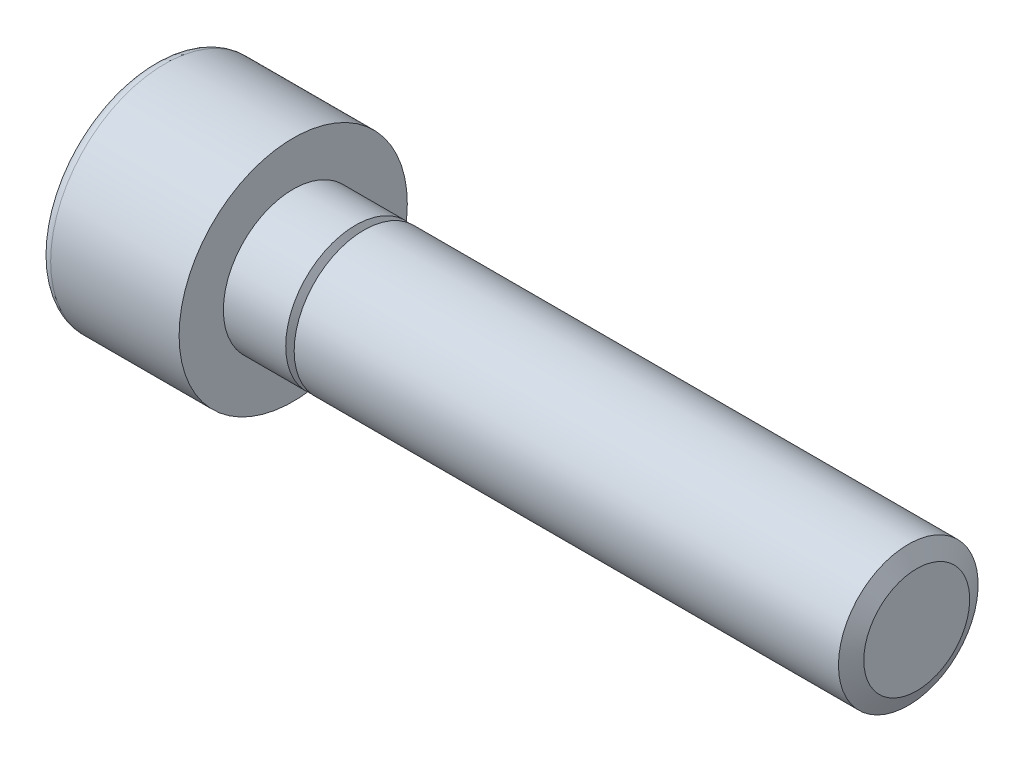
ISO-10303-21;
HEADER;
FILE_DESCRIPTION(('STEP AP214'),'2;1');
FILE_NAME('part.step','',(''),(''),'','','');
FILE_SCHEMA(('AUTOMOTIVE_DESIGN { 1 0 10303 214 1 1 1 1 }'));
ENDSEC;
DATA;
#1=APPLICATION_CONTEXT('core data for automotive mechanical design processes');
#2=APPLICATION_PROTOCOL_DEFINITION('international standard','automotive_design',2000,#1);
#3=PRODUCT_CONTEXT('',#1,'mechanical');
#4=PRODUCT('Part','Part','',(#3));
#5=PRODUCT_RELATED_PRODUCT_CATEGORY('part','',(#4));
#6=PRODUCT_DEFINITION_FORMATION('','',#4);
#7=PRODUCT_DEFINITION_CONTEXT('part definition',#1,'design');
#8=PRODUCT_DEFINITION('design','',#6,#7);
#9=PRODUCT_DEFINITION_SHAPE('','',#8);
#10=(LENGTH_UNIT() NAMED_UNIT(*) SI_UNIT(.MILLI.,.METRE.));
#11=(NAMED_UNIT(*) PLANE_ANGLE_UNIT() SI_UNIT($,.RADIAN.));
#12=(NAMED_UNIT(*) SI_UNIT($,.STERADIAN.) SOLID_ANGLE_UNIT());
#13=UNCERTAINTY_MEASURE_WITH_UNIT(LENGTH_MEASURE(1.E-05),#10,'distance_accuracy_value','');
#14=(GEOMETRIC_REPRESENTATION_CONTEXT(3) GLOBAL_UNCERTAINTY_ASSIGNED_CONTEXT((#13)) GLOBAL_UNIT_ASSIGNED_CONTEXT((#10,
#11,#12)) REPRESENTATION_CONTEXT('',''));
#15=CARTESIAN_POINT('',(0.,0.,0.));
#16=DIRECTION('',(0.,0.,1.));
#17=DIRECTION('',(1.,0.,0.));
#18=AXIS2_PLACEMENT_3D('',#15,#16,#17);
#19=CARTESIAN_POINT('',(-2.8448,0.,0.));
#20=DIRECTION('',(-1.,0.,0.));
#21=DIRECTION('',(0.,0.,1.));
#22=AXIS2_PLACEMENT_3D('',#19,#20,#21);
#23=PLANE('',#22);
#24=CARTESIAN_POINT('',(-2.8448,0.,0.));
#25=DIRECTION('',(-1.,0.,0.));
#26=DIRECTION('',(0.,0.,1.));
#27=AXIS2_PLACEMENT_3D('',#24,#25,#26);
#28=CIRCLE('',#27,2.0955);
#29=CARTESIAN_POINT('',(-2.8448,0.,2.0955));
#30=VERTEX_POINT('',#29);
#31=EDGE_CURVE('E105',#30,#30,#28,.T.);
#32=ORIENTED_EDGE('',*,*,#31,.T.);
#33=EDGE_LOOP('',(#32));
#34=FACE_BOUND('',#33,.T.);
#35=DIRECTION('',(0.,-1.,0.));
#36=VECTOR('',#35,1.);
#37=CARTESIAN_POINT('',(-2.8448,0.,1.1938));
#38=LINE('',#37,#36);
#39=CARTESIAN_POINT('',(-2.8448,0.689240751358576,1.1938));
#40=VERTEX_POINT('',#39);
#41=CARTESIAN_POINT('',(-2.8448,-0.689240751358574,1.1938));
#42=VERTEX_POINT('',#41);
#43=EDGE_CURVE('E133',#40,#42,#38,.T.);
#44=ORIENTED_EDGE('',*,*,#43,.T.);
#45=DIRECTION('',(0.,-0.5,-0.866025403784439));
#46=VECTOR('',#45,1.);
#47=CARTESIAN_POINT('',(-2.8448,-1.03386112703786,0.5969));
#48=LINE('',#47,#46);
#49=CARTESIAN_POINT('',(-2.8448,-1.37848150271715,0.));
#50=VERTEX_POINT('',#49);
#51=EDGE_CURVE('E10',#42,#50,#48,.T.);
#52=ORIENTED_EDGE('',*,*,#51,.T.);
#53=DIRECTION('',(0.,0.5,-0.866025403784439));
#54=VECTOR('',#53,1.);
#55=CARTESIAN_POINT('',(-2.8448,-1.03386112703786,-0.5969));
#56=LINE('',#55,#54);
#57=CARTESIAN_POINT('',(-2.8448,-0.689240751358576,-1.1938));
#58=VERTEX_POINT('',#57);
#59=EDGE_CURVE('E24',#50,#58,#56,.T.);
#60=ORIENTED_EDGE('',*,*,#59,.T.);
#61=DIRECTION('',(0.,1.,0.));
#62=VECTOR('',#61,1.);
#63=CARTESIAN_POINT('',(-2.8448,0.,-1.1938));
#64=LINE('',#63,#62);
#65=CARTESIAN_POINT('',(-2.8448,0.689240751358575,-1.1938));
#66=VERTEX_POINT('',#65);
#67=EDGE_CURVE('E145',#58,#66,#64,.T.);
#68=ORIENTED_EDGE('',*,*,#67,.T.);
#69=DIRECTION('',(0.,0.5,0.866025403784439));
#70=VECTOR('',#69,1.);
#71=CARTESIAN_POINT('',(-2.8448,1.03386112703786,-0.5969));
#72=LINE('',#71,#70);
#73=CARTESIAN_POINT('',(-2.8448,1.37848150271715,0.));
#74=VERTEX_POINT('',#73);
#75=EDGE_CURVE('E141',#66,#74,#72,.T.);
#76=ORIENTED_EDGE('',*,*,#75,.T.);
#77=DIRECTION('',(0.,-0.5,0.866025403784439));
#78=VECTOR('',#77,1.);
#79=CARTESIAN_POINT('',(-2.8448,1.03386112703786,0.5969));
#80=LINE('',#79,#78);
#81=EDGE_CURVE('E137',#74,#40,#80,.T.);
#82=ORIENTED_EDGE('',*,*,#81,.T.);
#83=EDGE_LOOP('',(#44,#52,#60,#68,#76,#82));
#84=FACE_BOUND('',#83,.T.);
#85=ADVANCED_FACE('F15',(#34,#84),#23,.T.);
#86=CARTESIAN_POINT('',(0.,-2.3241,0.));
#87=DIRECTION('',(1.,0.,0.));
#88=DIRECTION('',(0.,0.,-1.));
#89=AXIS2_PLACEMENT_3D('',#86,#87,#88);
#90=PLANE('',#89);
#91=CARTESIAN_POINT('',(0.,0.,0.));
#92=DIRECTION('',(-1.,0.,0.));
#93=DIRECTION('',(0.,0.,1.));
#94=AXIS2_PLACEMENT_3D('',#91,#92,#93);
#95=CIRCLE('',#94,1.4224);
#96=CARTESIAN_POINT('',(0.,0.,1.4224));
#97=VERTEX_POINT('',#96);
#98=EDGE_CURVE('E129',#97,#97,#95,.T.);
#99=ORIENTED_EDGE('',*,*,#98,.T.);
#100=EDGE_LOOP('',(#99));
#101=FACE_BOUND('',#100,.T.);
#102=CARTESIAN_POINT('',(0.,0.,0.));
#103=DIRECTION('',(-1.,0.,0.));
#104=DIRECTION('',(0.,0.,1.));
#105=AXIS2_PLACEMENT_3D('',#102,#103,#104);
#106=CIRCLE('',#105,2.3241);
#107=CARTESIAN_POINT('',(0.,0.,2.3241));
#108=VERTEX_POINT('',#107);
#109=EDGE_CURVE('E87',#108,#108,#106,.T.);
#110=ORIENTED_EDGE('',*,*,#109,.F.);
#111=EDGE_LOOP('',(#110));
#112=FACE_BOUND('',#111,.T.);
#113=ADVANCED_FACE('F17',(#101,#112),#90,.T.);
#114=CARTESIAN_POINT('',(-2.8448,0.,0.));
#115=DIRECTION('',(-1.,0.,0.));
#116=DIRECTION('',(0.,0.,1.));
#117=AXIS2_PLACEMENT_3D('',#114,#115,#116);
#118=CYLINDRICAL_SURFACE('',#117,1.4224);
#119=CARTESIAN_POINT('',(1.27,0.,0.));
#120=DIRECTION('',(-1.,0.,0.));
#121=DIRECTION('',(0.,0.,1.));
#122=AXIS2_PLACEMENT_3D('',#119,#120,#121);
#123=CIRCLE('',#122,1.4224);
#124=CARTESIAN_POINT('',(1.27,0.,1.4224));
#125=VERTEX_POINT('',#124);
#126=EDGE_CURVE('E125',#125,#125,#123,.T.);
#127=ORIENTED_EDGE('',*,*,#126,.T.);
#128=EDGE_LOOP('',(#127));
#129=FACE_BOUND('',#128,.T.);
#130=ORIENTED_EDGE('',*,*,#98,.F.);
#131=EDGE_LOOP('',(#130));
#132=FACE_BOUND('',#131,.T.);
#133=ADVANCED_FACE('F331',(#129,#132),#118,.T.);
#134=CARTESIAN_POINT('',(1.27,0.,0.));
#135=DIRECTION('',(-1.,0.,0.));
#136=DIRECTION('',(0.,0.,1.));
#137=AXIS2_PLACEMENT_3D('',#134,#135,#136);
#138=CONICAL_SURFACE('',#137,1.4224,1.10714871779409);
#139=CARTESIAN_POINT('',(1.442085,0.,0.));
#140=DIRECTION('',(-1.,0.,0.));
#141=DIRECTION('',(0.,0.,1.));
#142=AXIS2_PLACEMENT_3D('',#139,#140,#141);
#143=CIRCLE('',#142,1.07823);
#144=CARTESIAN_POINT('',(1.442085,0.,1.07823));
#145=VERTEX_POINT('',#144);
#146=EDGE_CURVE('E121',#145,#145,#143,.T.);
#147=ORIENTED_EDGE('',*,*,#146,.T.);
#148=EDGE_LOOP('',(#147));
#149=FACE_BOUND('',#148,.T.);
#150=ORIENTED_EDGE('',*,*,#126,.F.);
#151=EDGE_LOOP('',(#150));
#152=FACE_BOUND('',#151,.T.);
#153=ADVANCED_FACE('F320',(#149,#152),#138,.T.);
#154=CARTESIAN_POINT('',(1.442085,-1.07823,0.));
#155=DIRECTION('',(-1.,0.,0.));
#156=DIRECTION('',(0.,0.,1.));
#157=AXIS2_PLACEMENT_3D('',#154,#155,#156);
#158=PLANE('',#157);
#159=CARTESIAN_POINT('',(1.442085,0.,0.));
#160=DIRECTION('',(-1.,0.,0.));
#161=DIRECTION('',(0.,0.,1.));
#162=AXIS2_PLACEMENT_3D('',#159,#160,#161);
#163=CIRCLE('',#162,1.4224);
#164=CARTESIAN_POINT('',(1.442085,0.,1.4224));
#165=VERTEX_POINT('',#164);
#166=EDGE_CURVE('E117',#165,#165,#163,.T.);
#167=ORIENTED_EDGE('',*,*,#166,.T.);
#168=EDGE_LOOP('',(#167));
#169=FACE_BOUND('',#168,.T.);
#170=ORIENTED_EDGE('',*,*,#146,.F.);
#171=EDGE_LOOP('',(#170));
#172=FACE_BOUND('',#171,.T.);
#173=ADVANCED_FACE('F309',(#169,#172),#158,.T.);
#174=CARTESIAN_POINT('',(-2.8448,0.,0.));
#175=DIRECTION('',(-1.,0.,0.));
#176=DIRECTION('',(0.,0.,1.));
#177=AXIS2_PLACEMENT_3D('',#174,#175,#176);
#178=CYLINDRICAL_SURFACE('',#177,1.4224);
#179=CARTESIAN_POINT('',(12.527915,0.,0.));
#180=DIRECTION('',(-1.,0.,0.));
#181=DIRECTION('',(0.,0.,1.));
#182=AXIS2_PLACEMENT_3D('',#179,#180,#181);
#183=CIRCLE('',#182,1.4224);
#184=CARTESIAN_POINT('',(12.527915,0.,1.4224));
#185=VERTEX_POINT('',#184);
#186=EDGE_CURVE('E113',#185,#185,#183,.T.);
#187=ORIENTED_EDGE('',*,*,#186,.T.);
#188=EDGE_LOOP('',(#187));
#189=FACE_BOUND('',#188,.T.);
#190=ORIENTED_EDGE('',*,*,#166,.F.);
#191=EDGE_LOOP('',(#190));
#192=FACE_BOUND('',#191,.T.);
#193=ADVANCED_FACE('F298',(#189,#192),#178,.T.);
#194=CARTESIAN_POINT('',(12.527915,0.,0.));
#195=DIRECTION('',(-1.,0.,0.));
#196=DIRECTION('',(0.,0.,1.));
#197=AXIS2_PLACEMENT_3D('',#194,#195,#196);
#198=CONICAL_SURFACE('',#197,1.4224,1.10714871779409);
#199=CARTESIAN_POINT('',(12.7,0.,0.));
#200=DIRECTION('',(-1.,0.,0.));
#201=DIRECTION('',(0.,0.,1.));
#202=AXIS2_PLACEMENT_3D('',#199,#200,#201);
#203=CIRCLE('',#202,1.07823);
#204=CARTESIAN_POINT('',(12.7,0.,1.07823));
#205=VERTEX_POINT('',#204);
#206=EDGE_CURVE('E109',#205,#205,#203,.T.);
#207=ORIENTED_EDGE('',*,*,#206,.T.);
#208=EDGE_LOOP('',(#207));
#209=FACE_BOUND('',#208,.T.);
#210=ORIENTED_EDGE('',*,*,#186,.F.);
#211=EDGE_LOOP('',(#210));
#212=FACE_BOUND('',#211,.T.);
#213=ADVANCED_FACE('F287',(#209,#212),#198,.T.);
#214=CARTESIAN_POINT('',(12.7,-1.07823,0.));
#215=DIRECTION('',(1.,0.,0.));
#216=DIRECTION('',(0.,0.,-1.));
#217=AXIS2_PLACEMENT_3D('',#214,#215,#216);
#218=PLANE('',#217);
#219=ORIENTED_EDGE('',*,*,#206,.F.);
#220=EDGE_LOOP('',(#219));
#221=FACE_BOUND('',#220,.T.);
#222=ADVANCED_FACE('F276',(#221),#218,.T.);
#223=CARTESIAN_POINT('',(-2.6162,0.,0.));
#224=DIRECTION('',(-1.,0.,0.));
#225=DIRECTION('',(0.,0.,1.));
#226=AXIS2_PLACEMENT_3D('',#223,#224,#225);
#227=TOROIDAL_SURFACE('',#226,2.0955,0.2286);
#228=CARTESIAN_POINT('',(-2.6162,0.,0.));
#229=DIRECTION('',(-1.,0.,0.));
#230=DIRECTION('',(0.,0.,1.));
#231=AXIS2_PLACEMENT_3D('',#228,#229,#230);
#232=CIRCLE('',#231,2.3241);
#233=CARTESIAN_POINT('',(-2.6162,0.,2.3241));
#234=VERTEX_POINT('',#233);
#235=EDGE_CURVE('E95',#234,#234,#232,.T.);
#236=ORIENTED_EDGE('',*,*,#235,.T.);
#237=EDGE_LOOP('',(#236));
#238=FACE_BOUND('',#237,.T.);
#239=ORIENTED_EDGE('',*,*,#31,.F.);
#240=EDGE_LOOP('',(#239));
#241=FACE_BOUND('',#240,.T.);
#242=ADVANCED_FACE('F265',(#238,#241),#227,.T.);
#243=CARTESIAN_POINT('',(-2.8448,0.,0.));
#244=DIRECTION('',(-1.,0.,0.));
#245=DIRECTION('',(0.,0.,1.));
#246=AXIS2_PLACEMENT_3D('',#243,#244,#245);
#247=CYLINDRICAL_SURFACE('',#246,2.3241);
#248=ORIENTED_EDGE('',*,*,#109,.T.);
#249=EDGE_LOOP('',(#248));
#250=FACE_BOUND('',#249,.T.);
#251=ORIENTED_EDGE('',*,*,#235,.F.);
#252=EDGE_LOOP('',(#251));
#253=FACE_BOUND('',#252,.T.);
#254=ADVANCED_FACE('F255',(#250,#253),#247,.T.);
#255=CARTESIAN_POINT('',(-1.5494,-0.689240751358574,1.1938));
#256=DIRECTION('',(0.,0.866025403784439,-0.5));
#257=DIRECTION('',(0.,0.5,0.866025403784439));
#258=AXIS2_PLACEMENT_3D('',#255,#256,#257);
#259=PLANE('',#258);
#260=DIRECTION('',(-1.,0.,0.));
#261=VECTOR('',#260,1.);
#262=CARTESIAN_POINT('',(-1.5494,-0.689240751358574,1.1938));
#263=LINE('',#262,#261);
#264=CARTESIAN_POINT('',(-1.5494,-0.689240751358574,1.1938));
#265=VERTEX_POINT('',#264);
#266=EDGE_CURVE('E31',#265,#42,#263,.T.);
#267=ORIENTED_EDGE('',*,*,#266,.F.);
#268=DIRECTION('',(0.,-0.5,-0.866025403784439));
#269=VECTOR('',#268,1.);
#270=CARTESIAN_POINT('',(-1.5494,-0.689240751358574,1.1938));
#271=LINE('',#270,#269);
#272=CARTESIAN_POINT('',(-1.5494,-1.37848150271715,0.));
#273=VERTEX_POINT('',#272);
#274=EDGE_CURVE('E74',#265,#273,#271,.T.);
#275=ORIENTED_EDGE('',*,*,#274,.T.);
#276=DIRECTION('',(-1.,0.,0.));
#277=VECTOR('',#276,1.);
#278=CARTESIAN_POINT('',(-1.5494,-1.37848150271715,0.));
#279=LINE('',#278,#277);
#280=EDGE_CURVE('E82',#273,#50,#279,.T.);
#281=ORIENTED_EDGE('',*,*,#280,.T.);
#282=ORIENTED_EDGE('',*,*,#51,.F.);
#283=EDGE_LOOP('',(#267,#275,#281,#282));
#284=FACE_BOUND('',#283,.T.);
#285=ADVANCED_FACE('F81',(#284),#259,.T.);
#286=CARTESIAN_POINT('',(-1.5494,-1.37848150271715,0.));
#287=DIRECTION('',(0.,0.866025403784439,0.5));
#288=DIRECTION('',(0.,-0.5,0.866025403784439));
#289=AXIS2_PLACEMENT_3D('',#286,#287,#288);
#290=PLANE('',#289);
#291=ORIENTED_EDGE('',*,*,#280,.F.);
#292=DIRECTION('',(0.,0.5,-0.866025403784439));
#293=VECTOR('',#292,1.);
#294=CARTESIAN_POINT('',(-1.5494,-1.37848150271715,0.));
#295=LINE('',#294,#293);
#296=CARTESIAN_POINT('',(-1.5494,-0.689240751358576,-1.1938));
#297=VERTEX_POINT('',#296);
#298=EDGE_CURVE('E70',#273,#297,#295,.T.);
#299=ORIENTED_EDGE('',*,*,#298,.T.);
#300=DIRECTION('',(-1.,0.,0.));
#301=VECTOR('',#300,1.);
#302=CARTESIAN_POINT('',(-1.5494,-0.689240751358576,-1.1938));
#303=LINE('',#302,#301);
#304=EDGE_CURVE('E88',#297,#58,#303,.T.);
#305=ORIENTED_EDGE('',*,*,#304,.T.);
#306=ORIENTED_EDGE('',*,*,#59,.F.);
#307=EDGE_LOOP('',(#291,#299,#305,#306));
#308=FACE_BOUND('',#307,.T.);
#309=ADVANCED_FACE('F85',(#308),#290,.T.);
#310=CARTESIAN_POINT('',(-1.5494,-0.689240751358576,-1.1938));
#311=DIRECTION('',(0.,0.,1.));
#312=DIRECTION('',(0.,-1.,0.));
#313=AXIS2_PLACEMENT_3D('',#310,#311,#312);
#314=PLANE('',#313);
#315=ORIENTED_EDGE('',*,*,#304,.F.);
#316=DIRECTION('',(0.,1.,0.));
#317=VECTOR('',#316,1.);
#318=CARTESIAN_POINT('',(-1.5494,-0.689240751358576,-1.1938));
#319=LINE('',#318,#317);
#320=CARTESIAN_POINT('',(-1.5494,0.689240751358575,-1.1938));
#321=VERTEX_POINT('',#320);
#322=EDGE_CURVE('E76',#297,#321,#319,.T.);
#323=ORIENTED_EDGE('',*,*,#322,.T.);
#324=DIRECTION('',(-1.,0.,0.));
#325=VECTOR('',#324,1.);
#326=CARTESIAN_POINT('',(-1.5494,0.689240751358575,-1.1938));
#327=LINE('',#326,#325);
#328=EDGE_CURVE('E98',#321,#66,#327,.T.);
#329=ORIENTED_EDGE('',*,*,#328,.T.);
#330=ORIENTED_EDGE('',*,*,#67,.F.);
#331=EDGE_LOOP('',(#315,#323,#329,#330));
#332=FACE_BOUND('',#331,.T.);
#333=ADVANCED_FACE('F179',(#332),#314,.T.);
#334=CARTESIAN_POINT('',(-1.5494,0.689240751358575,-1.1938));
#335=DIRECTION('',(0.,-0.866025403784439,0.5));
#336=DIRECTION('',(0.,-0.5,-0.866025403784439));
#337=AXIS2_PLACEMENT_3D('',#334,#335,#336);
#338=PLANE('',#337);
#339=ORIENTED_EDGE('',*,*,#328,.F.);
#340=DIRECTION('',(0.,0.5,0.866025403784439));
#341=VECTOR('',#340,1.);
#342=CARTESIAN_POINT('',(-1.5494,0.689240751358575,-1.1938));
#343=LINE('',#342,#341);
#344=CARTESIAN_POINT('',(-1.5494,1.37848150271715,0.));
#345=VERTEX_POINT('',#344);
#346=EDGE_CURVE('E182',#321,#345,#343,.T.);
#347=ORIENTED_EDGE('',*,*,#346,.T.);
#348=DIRECTION('',(-1.,0.,0.));
#349=VECTOR('',#348,1.);
#350=CARTESIAN_POINT('',(-1.5494,1.37848150271715,0.));
#351=LINE('',#350,#349);
#352=EDGE_CURVE('E162',#345,#74,#351,.T.);
#353=ORIENTED_EDGE('',*,*,#352,.T.);
#354=ORIENTED_EDGE('',*,*,#75,.F.);
#355=EDGE_LOOP('',(#339,#347,#353,#354));
#356=FACE_BOUND('',#355,.T.);
#357=ADVANCED_FACE('F181',(#356),#338,.T.);
#358=CARTESIAN_POINT('',(-1.5494,1.37848150271715,0.));
#359=DIRECTION('',(0.,-0.866025403784439,-0.5));
#360=DIRECTION('',(0.,0.5,-0.866025403784439));
#361=AXIS2_PLACEMENT_3D('',#358,#359,#360);
#362=PLANE('',#361);
#363=ORIENTED_EDGE('',*,*,#352,.F.);
#364=DIRECTION('',(0.,-0.5,0.866025403784439));
#365=VECTOR('',#364,1.);
#366=CARTESIAN_POINT('',(-1.5494,1.37848150271715,0.));
#367=LINE('',#366,#365);
#368=CARTESIAN_POINT('',(-1.5494,0.689240751358576,1.1938));
#369=VERTEX_POINT('',#368);
#370=EDGE_CURVE('E160',#345,#369,#367,.T.);
#371=ORIENTED_EDGE('',*,*,#370,.T.);
#372=DIRECTION('',(-1.,0.,0.));
#373=VECTOR('',#372,1.);
#374=CARTESIAN_POINT('',(-1.5494,0.689240751358576,1.1938));
#375=LINE('',#374,#373);
#376=EDGE_CURVE('E154',#369,#40,#375,.T.);
#377=ORIENTED_EDGE('',*,*,#376,.T.);
#378=ORIENTED_EDGE('',*,*,#81,.F.);
#379=EDGE_LOOP('',(#363,#371,#377,#378));
#380=FACE_BOUND('',#379,.T.);
#381=ADVANCED_FACE('F157',(#380),#362,.T.);
#382=CARTESIAN_POINT('',(-1.5494,0.689240751358576,1.1938));
#383=DIRECTION('',(0.,0.,-1.));
#384=DIRECTION('',(0.,1.,0.));
#385=AXIS2_PLACEMENT_3D('',#382,#383,#384);
#386=PLANE('',#385);
#387=ORIENTED_EDGE('',*,*,#376,.F.);
#388=DIRECTION('',(0.,-1.,0.));
#389=VECTOR('',#388,1.);
#390=CARTESIAN_POINT('',(-1.5494,0.689240751358576,1.1938));
#391=LINE('',#390,#389);
#392=EDGE_CURVE('E170',#369,#265,#391,.T.);
#393=ORIENTED_EDGE('',*,*,#392,.T.);
#394=ORIENTED_EDGE('',*,*,#266,.T.);
#395=ORIENTED_EDGE('',*,*,#43,.F.);
#396=EDGE_LOOP('',(#387,#393,#394,#395));
#397=FACE_BOUND('',#396,.T.);
#398=ADVANCED_FACE('F153',(#397),#386,.T.);
#399=CARTESIAN_POINT('',(-1.5494,-0.689240751358574,1.1938));
#400=DIRECTION('',(-1.,0.,0.));
#401=DIRECTION('',(0.,0.,-1.));
#402=AXIS2_PLACEMENT_3D('',#399,#400,#401);
#403=PLANE('',#402);
#404=ORIENTED_EDGE('',*,*,#274,.F.);
#405=ORIENTED_EDGE('',*,*,#392,.F.);
#406=ORIENTED_EDGE('',*,*,#370,.F.);
#407=ORIENTED_EDGE('',*,*,#346,.F.);
#408=ORIENTED_EDGE('',*,*,#322,.F.);
#409=ORIENTED_EDGE('',*,*,#298,.F.);
#410=EDGE_LOOP('',(#404,#405,#406,#407,#408,#409));
#411=FACE_BOUND('',#410,.T.);
#412=ADVANCED_FACE('F72',(#411),#403,.T.);
#413=CLOSED_SHELL('',(#85,#113,#133,#153,#173,#193,#213,#222,#242,#254,#285,#309,#333,#357,#381,
#398,#412));
#414=MANIFOLD_SOLID_BREP('B1',#413);
#415=ADVANCED_BREP_SHAPE_REPRESENTATION('',(#18,#414),#14);
#416=SHAPE_DEFINITION_REPRESENTATION(#9,#415);
ENDSEC;
END-ISO-10303-21;
